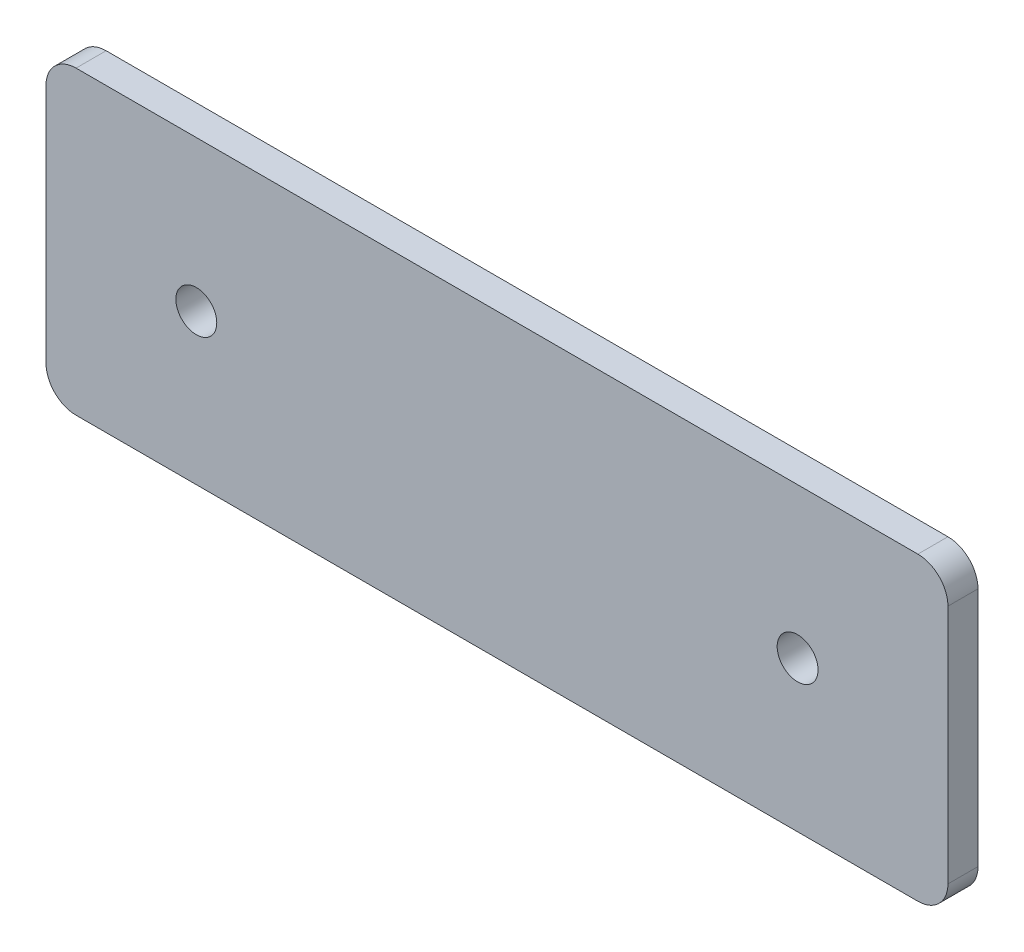
ISO-10303-21;
HEADER;
FILE_DESCRIPTION(('STEP AP214'),'2;1');
FILE_NAME('part.step','',(''),(''),'','','');
FILE_SCHEMA(('AUTOMOTIVE_DESIGN { 1 0 10303 214 1 1 1 1 }'));
ENDSEC;
DATA;
#1=APPLICATION_CONTEXT('core data for automotive mechanical design processes');
#2=APPLICATION_PROTOCOL_DEFINITION('international standard','automotive_design',2000,#1);
#3=PRODUCT_CONTEXT('',#1,'mechanical');
#4=PRODUCT('Part','Part','',(#3));
#5=PRODUCT_RELATED_PRODUCT_CATEGORY('part','',(#4));
#6=PRODUCT_DEFINITION_FORMATION('','',#4);
#7=PRODUCT_DEFINITION_CONTEXT('part definition',#1,'design');
#8=PRODUCT_DEFINITION('design','',#6,#7);
#9=PRODUCT_DEFINITION_SHAPE('','',#8);
#10=(LENGTH_UNIT() NAMED_UNIT(*) SI_UNIT(.MILLI.,.METRE.));
#11=(NAMED_UNIT(*) PLANE_ANGLE_UNIT() SI_UNIT($,.RADIAN.));
#12=(NAMED_UNIT(*) SI_UNIT($,.STERADIAN.) SOLID_ANGLE_UNIT());
#13=UNCERTAINTY_MEASURE_WITH_UNIT(LENGTH_MEASURE(1.E-05),#10,'distance_accuracy_value','');
#14=(GEOMETRIC_REPRESENTATION_CONTEXT(3) GLOBAL_UNCERTAINTY_ASSIGNED_CONTEXT((#13)) GLOBAL_UNIT_ASSIGNED_CONTEXT((#10,
#11,#12)) REPRESENTATION_CONTEXT('',''));
#15=CARTESIAN_POINT('',(0.,0.,0.));
#16=DIRECTION('',(0.,0.,1.));
#17=DIRECTION('',(1.,0.,0.));
#18=AXIS2_PLACEMENT_3D('',#15,#16,#17);
#19=CARTESIAN_POINT('',(70.,-20.,5.));
#20=DIRECTION('',(0.,0.,-1.));
#21=DIRECTION('',(-1.,0.,0.));
#22=AXIS2_PLACEMENT_3D('',#19,#20,#21);
#23=CYLINDRICAL_SURFACE('',#22,5.);
#24=CARTESIAN_POINT('',(70.,-20.,0.));
#25=DIRECTION('',(0.,0.,1.));
#26=DIRECTION('',(1.,0.,0.));
#27=AXIS2_PLACEMENT_3D('',#24,#25,#26);
#28=CIRCLE('',#27,5.);
#29=CARTESIAN_POINT('',(70.,-25.,0.));
#30=VERTEX_POINT('',#29);
#31=CARTESIAN_POINT('',(75.,-20.,0.));
#32=VERTEX_POINT('',#31);
#33=EDGE_CURVE('E130',#30,#32,#28,.T.);
#34=ORIENTED_EDGE('',*,*,#33,.T.);
#35=DIRECTION('',(0.,0.,-1.));
#36=VECTOR('',#35,1.);
#37=CARTESIAN_POINT('',(75.,-20.,5.));
#38=LINE('',#37,#36);
#39=CARTESIAN_POINT('',(75.,-20.,5.));
#40=VERTEX_POINT('',#39);
#41=EDGE_CURVE('E11',#40,#32,#38,.T.);
#42=ORIENTED_EDGE('',*,*,#41,.F.);
#43=CARTESIAN_POINT('',(70.,-20.,5.));
#44=DIRECTION('',(0.,0.,1.));
#45=DIRECTION('',(1.,0.,0.));
#46=AXIS2_PLACEMENT_3D('',#43,#44,#45);
#47=CIRCLE('',#46,5.);
#48=CARTESIAN_POINT('',(70.,-25.,5.));
#49=VERTEX_POINT('',#48);
#50=EDGE_CURVE('E145',#49,#40,#47,.T.);
#51=ORIENTED_EDGE('',*,*,#50,.F.);
#52=DIRECTION('',(0.,0.,-1.));
#53=VECTOR('',#52,1.);
#54=CARTESIAN_POINT('',(70.,-25.,5.));
#55=LINE('',#54,#53);
#56=EDGE_CURVE('E126',#49,#30,#55,.T.);
#57=ORIENTED_EDGE('',*,*,#56,.T.);
#58=EDGE_LOOP('',(#34,#42,#51,#57));
#59=FACE_BOUND('',#58,.T.);
#60=ADVANCED_FACE('F34',(#59),#23,.T.);
#61=CARTESIAN_POINT('',(75.,20.,5.));
#62=DIRECTION('',(-1.,0.,0.));
#63=DIRECTION('',(0.,-1.,0.));
#64=AXIS2_PLACEMENT_3D('',#61,#62,#63);
#65=PLANE('',#64);
#66=DIRECTION('',(0.,1.,0.));
#67=VECTOR('',#66,1.);
#68=CARTESIAN_POINT('',(75.,20.,0.));
#69=LINE('',#68,#67);
#70=CARTESIAN_POINT('',(75.,20.,0.));
#71=VERTEX_POINT('',#70);
#72=EDGE_CURVE('E133',#32,#71,#69,.T.);
#73=ORIENTED_EDGE('',*,*,#72,.T.);
#74=DIRECTION('',(0.,0.,-1.));
#75=VECTOR('',#74,1.);
#76=CARTESIAN_POINT('',(75.,20.,5.));
#77=LINE('',#76,#75);
#78=CARTESIAN_POINT('',(75.,20.,5.));
#79=VERTEX_POINT('',#78);
#80=EDGE_CURVE('E42',#79,#71,#77,.T.);
#81=ORIENTED_EDGE('',*,*,#80,.F.);
#82=DIRECTION('',(0.,1.,0.));
#83=VECTOR('',#82,1.);
#84=CARTESIAN_POINT('',(75.,20.,5.));
#85=LINE('',#84,#83);
#86=EDGE_CURVE('E93',#40,#79,#85,.T.);
#87=ORIENTED_EDGE('',*,*,#86,.F.);
#88=ORIENTED_EDGE('',*,*,#41,.T.);
#89=EDGE_LOOP('',(#73,#81,#87,#88));
#90=FACE_BOUND('',#89,.T.);
#91=ADVANCED_FACE('F212',(#90),#65,.F.);
#92=CARTESIAN_POINT('',(70.,20.,5.));
#93=DIRECTION('',(0.,0.,-1.));
#94=DIRECTION('',(-1.,0.,0.));
#95=AXIS2_PLACEMENT_3D('',#92,#93,#94);
#96=CYLINDRICAL_SURFACE('',#95,5.00000000000001);
#97=CARTESIAN_POINT('',(70.,20.,0.));
#98=DIRECTION('',(0.,0.,1.));
#99=DIRECTION('',(1.,0.,0.));
#100=AXIS2_PLACEMENT_3D('',#97,#98,#99);
#101=CIRCLE('',#100,5.00000000000001);
#102=CARTESIAN_POINT('',(70.,25.,0.));
#103=VERTEX_POINT('',#102);
#104=EDGE_CURVE('E136',#71,#103,#101,.T.);
#105=ORIENTED_EDGE('',*,*,#104,.T.);
#106=DIRECTION('',(0.,0.,-1.));
#107=VECTOR('',#106,1.);
#108=CARTESIAN_POINT('',(70.,25.,5.));
#109=LINE('',#108,#107);
#110=CARTESIAN_POINT('',(70.,25.,5.));
#111=VERTEX_POINT('',#110);
#112=EDGE_CURVE('E152',#111,#103,#109,.T.);
#113=ORIENTED_EDGE('',*,*,#112,.F.);
#114=CARTESIAN_POINT('',(70.,20.,5.));
#115=DIRECTION('',(0.,0.,1.));
#116=DIRECTION('',(1.,0.,0.));
#117=AXIS2_PLACEMENT_3D('',#114,#115,#116);
#118=CIRCLE('',#117,5.00000000000001);
#119=EDGE_CURVE('E160',#79,#111,#118,.T.);
#120=ORIENTED_EDGE('',*,*,#119,.F.);
#121=ORIENTED_EDGE('',*,*,#80,.T.);
#122=EDGE_LOOP('',(#105,#113,#120,#121));
#123=FACE_BOUND('',#122,.T.);
#124=ADVANCED_FACE('F158',(#123),#96,.T.);
#125=CARTESIAN_POINT('',(-70.,25.,5.));
#126=DIRECTION('',(0.,-1.,0.));
#127=DIRECTION('',(0.,0.,-1.));
#128=AXIS2_PLACEMENT_3D('',#125,#126,#127);
#129=PLANE('',#128);
#130=DIRECTION('',(-1.,0.,0.));
#131=VECTOR('',#130,1.);
#132=CARTESIAN_POINT('',(-70.,25.,0.));
#133=LINE('',#132,#131);
#134=CARTESIAN_POINT('',(-70.,25.,0.));
#135=VERTEX_POINT('',#134);
#136=EDGE_CURVE('E138',#103,#135,#133,.T.);
#137=ORIENTED_EDGE('',*,*,#136,.T.);
#138=DIRECTION('',(0.,0.,-1.));
#139=VECTOR('',#138,1.);
#140=CARTESIAN_POINT('',(-70.,25.,5.));
#141=LINE('',#140,#139);
#142=CARTESIAN_POINT('',(-70.,25.,5.));
#143=VERTEX_POINT('',#142);
#144=EDGE_CURVE('E149',#143,#135,#141,.T.);
#145=ORIENTED_EDGE('',*,*,#144,.F.);
#146=DIRECTION('',(-1.,0.,0.));
#147=VECTOR('',#146,1.);
#148=CARTESIAN_POINT('',(-70.,25.,5.));
#149=LINE('',#148,#147);
#150=EDGE_CURVE('E172',#111,#143,#149,.T.);
#151=ORIENTED_EDGE('',*,*,#150,.F.);
#152=ORIENTED_EDGE('',*,*,#112,.T.);
#153=EDGE_LOOP('',(#137,#145,#151,#152));
#154=FACE_BOUND('',#153,.T.);
#155=ADVANCED_FACE('F168',(#154),#129,.F.);
#156=CARTESIAN_POINT('',(-70.,20.,5.));
#157=DIRECTION('',(0.,0.,-1.));
#158=DIRECTION('',(-1.,0.,0.));
#159=AXIS2_PLACEMENT_3D('',#156,#157,#158);
#160=CYLINDRICAL_SURFACE('',#159,5.00000000000001);
#161=CARTESIAN_POINT('',(-70.,20.,0.));
#162=DIRECTION('',(0.,0.,1.));
#163=DIRECTION('',(1.,0.,0.));
#164=AXIS2_PLACEMENT_3D('',#161,#162,#163);
#165=CIRCLE('',#164,5.00000000000001);
#166=CARTESIAN_POINT('',(-75.,20.,0.));
#167=VERTEX_POINT('',#166);
#168=EDGE_CURVE('E140',#135,#167,#165,.T.);
#169=ORIENTED_EDGE('',*,*,#168,.T.);
#170=DIRECTION('',(0.,0.,-1.));
#171=VECTOR('',#170,1.);
#172=CARTESIAN_POINT('',(-75.,20.,5.));
#173=LINE('',#172,#171);
#174=CARTESIAN_POINT('',(-75.,20.,5.));
#175=VERTEX_POINT('',#174);
#176=EDGE_CURVE('E121',#175,#167,#173,.T.);
#177=ORIENTED_EDGE('',*,*,#176,.F.);
#178=CARTESIAN_POINT('',(-70.,20.,5.));
#179=DIRECTION('',(0.,0.,1.));
#180=DIRECTION('',(1.,0.,0.));
#181=AXIS2_PLACEMENT_3D('',#178,#179,#180);
#182=CIRCLE('',#181,5.00000000000001);
#183=EDGE_CURVE('E112',#143,#175,#182,.T.);
#184=ORIENTED_EDGE('',*,*,#183,.F.);
#185=ORIENTED_EDGE('',*,*,#144,.T.);
#186=EDGE_LOOP('',(#169,#177,#184,#185));
#187=FACE_BOUND('',#186,.T.);
#188=ADVANCED_FACE('F171',(#187),#160,.T.);
#189=CARTESIAN_POINT('',(-75.,20.,5.));
#190=DIRECTION('',(1.,0.,0.));
#191=DIRECTION('',(0.,1.,0.));
#192=AXIS2_PLACEMENT_3D('',#189,#190,#191);
#193=PLANE('',#192);
#194=DIRECTION('',(0.,-1.,0.));
#195=VECTOR('',#194,1.);
#196=CARTESIAN_POINT('',(-75.,20.,0.));
#197=LINE('',#196,#195);
#198=CARTESIAN_POINT('',(-75.,-20.,0.));
#199=VERTEX_POINT('',#198);
#200=EDGE_CURVE('E120',#167,#199,#197,.T.);
#201=ORIENTED_EDGE('',*,*,#200,.T.);
#202=DIRECTION('',(0.,0.,-1.));
#203=VECTOR('',#202,1.);
#204=CARTESIAN_POINT('',(-75.,-20.,5.));
#205=LINE('',#204,#203);
#206=CARTESIAN_POINT('',(-75.,-20.,5.));
#207=VERTEX_POINT('',#206);
#208=EDGE_CURVE('E117',#207,#199,#205,.T.);
#209=ORIENTED_EDGE('',*,*,#208,.F.);
#210=DIRECTION('',(0.,-1.,0.));
#211=VECTOR('',#210,1.);
#212=CARTESIAN_POINT('',(-75.,20.,5.));
#213=LINE('',#212,#211);
#214=EDGE_CURVE('E106',#175,#207,#213,.T.);
#215=ORIENTED_EDGE('',*,*,#214,.F.);
#216=ORIENTED_EDGE('',*,*,#176,.T.);
#217=EDGE_LOOP('',(#201,#209,#215,#216));
#218=FACE_BOUND('',#217,.T.);
#219=ADVANCED_FACE('F118',(#218),#193,.F.);
#220=CARTESIAN_POINT('',(-70.,-20.,5.));
#221=DIRECTION('',(0.,0.,-1.));
#222=DIRECTION('',(-1.,0.,0.));
#223=AXIS2_PLACEMENT_3D('',#220,#221,#222);
#224=CYLINDRICAL_SURFACE('',#223,5.00000000000001);
#225=CARTESIAN_POINT('',(-70.,-20.,0.));
#226=DIRECTION('',(0.,0.,1.));
#227=DIRECTION('',(-1.,0.,0.));
#228=AXIS2_PLACEMENT_3D('',#225,#226,#227);
#229=CIRCLE('',#228,5.00000000000001);
#230=CARTESIAN_POINT('',(-70.,-25.,0.));
#231=VERTEX_POINT('',#230);
#232=EDGE_CURVE('E79',#199,#231,#229,.T.);
#233=ORIENTED_EDGE('',*,*,#232,.T.);
#234=DIRECTION('',(0.,0.,-1.));
#235=VECTOR('',#234,1.);
#236=CARTESIAN_POINT('',(-70.,-25.,5.));
#237=LINE('',#236,#235);
#238=CARTESIAN_POINT('',(-70.,-25.,5.));
#239=VERTEX_POINT('',#238);
#240=EDGE_CURVE('E122',#239,#231,#237,.T.);
#241=ORIENTED_EDGE('',*,*,#240,.F.);
#242=CARTESIAN_POINT('',(-70.,-20.,5.));
#243=DIRECTION('',(0.,0.,1.));
#244=DIRECTION('',(-1.,0.,0.));
#245=AXIS2_PLACEMENT_3D('',#242,#243,#244);
#246=CIRCLE('',#245,5.00000000000001);
#247=EDGE_CURVE('E110',#207,#239,#246,.T.);
#248=ORIENTED_EDGE('',*,*,#247,.F.);
#249=ORIENTED_EDGE('',*,*,#208,.T.);
#250=EDGE_LOOP('',(#233,#241,#248,#249));
#251=FACE_BOUND('',#250,.T.);
#252=ADVANCED_FACE('F124',(#251),#224,.T.);
#253=CARTESIAN_POINT('',(-70.,-25.,5.));
#254=DIRECTION('',(0.,1.,0.));
#255=DIRECTION('',(-1.,0.,0.));
#256=AXIS2_PLACEMENT_3D('',#253,#254,#255);
#257=PLANE('',#256);
#258=DIRECTION('',(1.,0.,0.));
#259=VECTOR('',#258,1.);
#260=CARTESIAN_POINT('',(-70.,-25.,0.));
#261=LINE('',#260,#259);
#262=EDGE_CURVE('E85',#231,#30,#261,.T.);
#263=ORIENTED_EDGE('',*,*,#262,.T.);
#264=ORIENTED_EDGE('',*,*,#56,.F.);
#265=DIRECTION('',(1.,0.,0.));
#266=VECTOR('',#265,1.);
#267=CARTESIAN_POINT('',(-70.,-25.,5.));
#268=LINE('',#267,#266);
#269=EDGE_CURVE('E50',#239,#49,#268,.T.);
#270=ORIENTED_EDGE('',*,*,#269,.F.);
#271=ORIENTED_EDGE('',*,*,#240,.T.);
#272=EDGE_LOOP('',(#263,#264,#270,#271));
#273=FACE_BOUND('',#272,.T.);
#274=ADVANCED_FACE('F194',(#273),#257,.F.);
#275=CARTESIAN_POINT('',(70.,-20.,5.));
#276=DIRECTION('',(0.,0.,1.));
#277=DIRECTION('',(1.,0.,0.));
#278=AXIS2_PLACEMENT_3D('',#275,#276,#277);
#279=PLANE('',#278);
#280=CARTESIAN_POINT('',(-50.,0.,5.));
#281=DIRECTION('',(0.,0.,1.));
#282=DIRECTION('',(1.,0.,0.));
#283=AXIS2_PLACEMENT_3D('',#280,#281,#282);
#284=CIRCLE('',#283,3.4);
#285=CARTESIAN_POINT('',(-46.6,0.,5.));
#286=VERTEX_POINT('',#285);
#287=EDGE_CURVE('E186',#286,#286,#284,.T.);
#288=ORIENTED_EDGE('',*,*,#287,.F.);
#289=EDGE_LOOP('',(#288));
#290=FACE_BOUND('',#289,.T.);
#291=CARTESIAN_POINT('',(50.,0.,5.));
#292=DIRECTION('',(0.,0.,1.));
#293=DIRECTION('',(1.,0.,0.));
#294=AXIS2_PLACEMENT_3D('',#291,#292,#293);
#295=CIRCLE('',#294,3.4);
#296=CARTESIAN_POINT('',(53.4,0.,5.));
#297=VERTEX_POINT('',#296);
#298=EDGE_CURVE('E180',#297,#297,#295,.T.);
#299=ORIENTED_EDGE('',*,*,#298,.F.);
#300=EDGE_LOOP('',(#299));
#301=FACE_BOUND('',#300,.T.);
#302=ORIENTED_EDGE('',*,*,#50,.T.);
#303=ORIENTED_EDGE('',*,*,#86,.T.);
#304=ORIENTED_EDGE('',*,*,#119,.T.);
#305=ORIENTED_EDGE('',*,*,#150,.T.);
#306=ORIENTED_EDGE('',*,*,#183,.T.);
#307=ORIENTED_EDGE('',*,*,#214,.T.);
#308=ORIENTED_EDGE('',*,*,#247,.T.);
#309=ORIENTED_EDGE('',*,*,#269,.T.);
#310=EDGE_LOOP('',(#302,#303,#304,#305,#306,#307,#308,#309));
#311=FACE_BOUND('',#310,.T.);
#312=ADVANCED_FACE('F108',(#290,#301,#311),#279,.T.);
#313=CARTESIAN_POINT('',(70.,-20.,0.));
#314=DIRECTION('',(0.,0.,1.));
#315=DIRECTION('',(1.,0.,0.));
#316=AXIS2_PLACEMENT_3D('',#313,#314,#315);
#317=PLANE('',#316);
#318=CARTESIAN_POINT('',(-50.,0.,0.));
#319=DIRECTION('',(0.,0.,1.));
#320=DIRECTION('',(1.,0.,0.));
#321=AXIS2_PLACEMENT_3D('',#318,#319,#320);
#322=CIRCLE('',#321,3.4);
#323=CARTESIAN_POINT('',(-46.6,0.,0.));
#324=VERTEX_POINT('',#323);
#325=EDGE_CURVE('E183',#324,#324,#322,.T.);
#326=ORIENTED_EDGE('',*,*,#325,.T.);
#327=EDGE_LOOP('',(#326));
#328=FACE_BOUND('',#327,.T.);
#329=CARTESIAN_POINT('',(50.,0.,0.));
#330=DIRECTION('',(0.,0.,1.));
#331=DIRECTION('',(1.,0.,0.));
#332=AXIS2_PLACEMENT_3D('',#329,#330,#331);
#333=CIRCLE('',#332,3.4);
#334=CARTESIAN_POINT('',(53.4,0.,0.));
#335=VERTEX_POINT('',#334);
#336=EDGE_CURVE('E134',#335,#335,#333,.T.);
#337=ORIENTED_EDGE('',*,*,#336,.T.);
#338=EDGE_LOOP('',(#337));
#339=FACE_BOUND('',#338,.T.);
#340=ORIENTED_EDGE('',*,*,#33,.F.);
#341=ORIENTED_EDGE('',*,*,#262,.F.);
#342=ORIENTED_EDGE('',*,*,#232,.F.);
#343=ORIENTED_EDGE('',*,*,#200,.F.);
#344=ORIENTED_EDGE('',*,*,#168,.F.);
#345=ORIENTED_EDGE('',*,*,#136,.F.);
#346=ORIENTED_EDGE('',*,*,#104,.F.);
#347=ORIENTED_EDGE('',*,*,#72,.F.);
#348=EDGE_LOOP('',(#340,#341,#342,#343,#344,#345,#346,#347));
#349=FACE_BOUND('',#348,.T.);
#350=ADVANCED_FACE('F164',(#328,#339,#349),#317,.F.);
#351=CARTESIAN_POINT('',(50.,0.,5.));
#352=DIRECTION('',(0.,0.,1.));
#353=DIRECTION('',(1.,0.,0.));
#354=AXIS2_PLACEMENT_3D('',#351,#352,#353);
#355=CYLINDRICAL_SURFACE('',#354,3.4);
#356=ORIENTED_EDGE('',*,*,#336,.F.);
#357=EDGE_LOOP('',(#356));
#358=FACE_BOUND('',#357,.T.);
#359=ORIENTED_EDGE('',*,*,#298,.T.);
#360=EDGE_LOOP('',(#359));
#361=FACE_BOUND('',#360,.T.);
#362=ADVANCED_FACE('F198',(#358,#361),#355,.F.);
#363=CARTESIAN_POINT('',(-50.,0.,5.));
#364=DIRECTION('',(0.,0.,1.));
#365=DIRECTION('',(1.,0.,0.));
#366=AXIS2_PLACEMENT_3D('',#363,#364,#365);
#367=CYLINDRICAL_SURFACE('',#366,3.4);
#368=ORIENTED_EDGE('',*,*,#325,.F.);
#369=EDGE_LOOP('',(#368));
#370=FACE_BOUND('',#369,.T.);
#371=ORIENTED_EDGE('',*,*,#287,.T.);
#372=EDGE_LOOP('',(#371));
#373=FACE_BOUND('',#372,.T.);
#374=ADVANCED_FACE('F190',(#370,#373),#367,.F.);
#375=CLOSED_SHELL('',(#60,#91,#124,#155,#188,#219,#252,#274,#312,#350,#362,#374));
#376=MANIFOLD_SOLID_BREP('B2',#375);
#377=ADVANCED_BREP_SHAPE_REPRESENTATION('',(#18,#376),#14);
#378=SHAPE_DEFINITION_REPRESENTATION(#9,#377);
ENDSEC;
END-ISO-10303-21;
